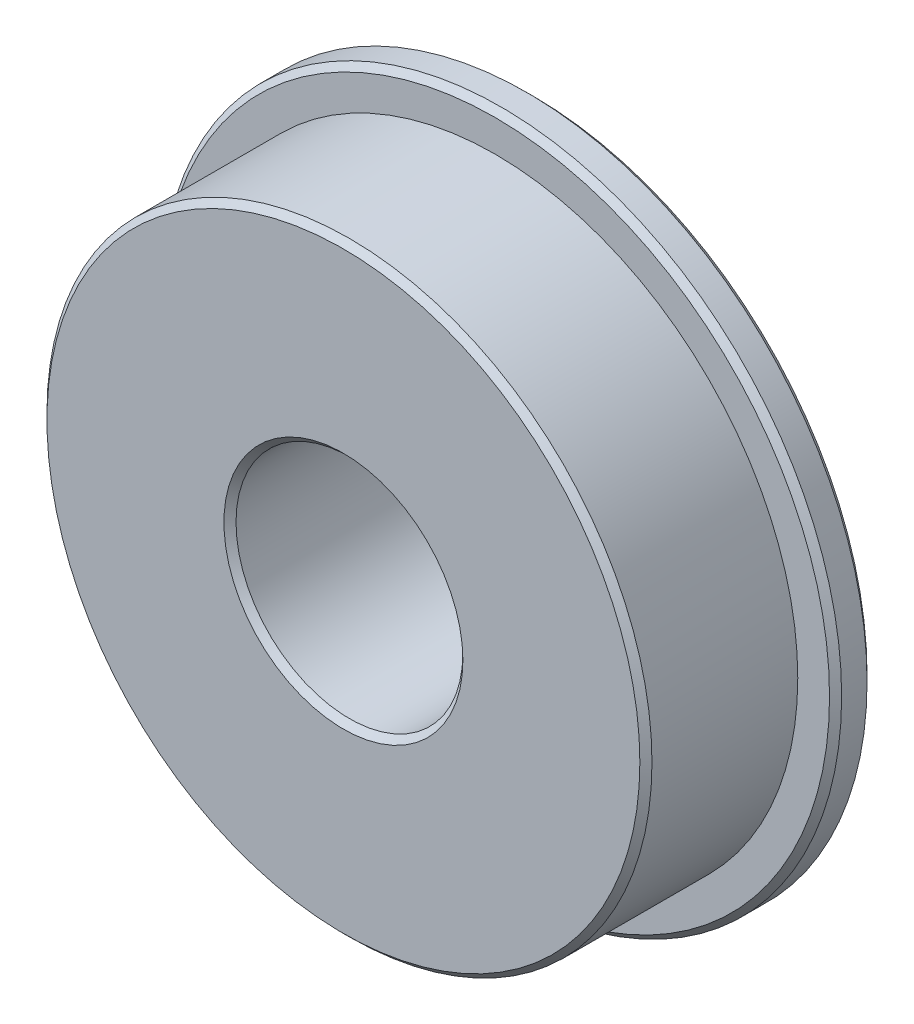
ISO-10303-21;
HEADER;
FILE_DESCRIPTION(('STEP AP214'),'2;1');
FILE_NAME('part.step','',(''),(''),'','','');
FILE_SCHEMA(('AUTOMOTIVE_DESIGN { 1 0 10303 214 1 1 1 1 }'));
ENDSEC;
DATA;
#1=APPLICATION_CONTEXT('core data for automotive mechanical design processes');
#2=APPLICATION_PROTOCOL_DEFINITION('international standard','automotive_design',2000,#1);
#3=PRODUCT_CONTEXT('',#1,'mechanical');
#4=PRODUCT('Part','Part','',(#3));
#5=PRODUCT_RELATED_PRODUCT_CATEGORY('part','',(#4));
#6=PRODUCT_DEFINITION_FORMATION('','',#4);
#7=PRODUCT_DEFINITION_CONTEXT('part definition',#1,'design');
#8=PRODUCT_DEFINITION('design','',#6,#7);
#9=PRODUCT_DEFINITION_SHAPE('','',#8);
#10=(LENGTH_UNIT() NAMED_UNIT(*) SI_UNIT(.MILLI.,.METRE.));
#11=(NAMED_UNIT(*) PLANE_ANGLE_UNIT() SI_UNIT($,.RADIAN.));
#12=(NAMED_UNIT(*) SI_UNIT($,.STERADIAN.) SOLID_ANGLE_UNIT());
#13=UNCERTAINTY_MEASURE_WITH_UNIT(LENGTH_MEASURE(1.E-05),#10,'distance_accuracy_value','');
#14=(GEOMETRIC_REPRESENTATION_CONTEXT(3) GLOBAL_UNCERTAINTY_ASSIGNED_CONTEXT((#13)) GLOBAL_UNIT_ASSIGNED_CONTEXT((#10,
#11,#12)) REPRESENTATION_CONTEXT('',''));
#15=CARTESIAN_POINT('',(0.,0.,0.));
#16=DIRECTION('',(0.,0.,1.));
#17=DIRECTION('',(1.,0.,0.));
#18=AXIS2_PLACEMENT_3D('',#15,#16,#17);
#19=CARTESIAN_POINT('',(-2.25753846153434,6.04195804195805,7.95020000007088));
#20=DIRECTION('',(0.,0.,1.));
#21=DIRECTION('',(1.,0.,0.));
#22=AXIS2_PLACEMENT_3D('',#19,#20,#21);
#23=PLANE('',#22);
#24=CARTESIAN_POINT('',(-7.27403846154836,6.04195804195805,7.95020000007088));
#25=DIRECTION('',(0.,0.,1.));
#26=DIRECTION('',(1.,0.,0.));
#27=AXIS2_PLACEMENT_3D('',#24,#25,#26);
#28=CIRCLE('',#27,12.4460000000249);
#29=CARTESIAN_POINT('',(5.17196153847652,6.04195804195805,7.95020000007088));
#30=VERTEX_POINT('',#29);
#31=EDGE_CURVE('E10',#30,#30,#28,.T.);
#32=ORIENTED_EDGE('',*,*,#31,.T.);
#33=EDGE_LOOP('',(#32));
#34=FACE_BOUND('',#33,.T.);
#35=CARTESIAN_POINT('',(-7.27403846154836,6.04195804195805,7.95020000007088));
#36=DIRECTION('',(0.,0.,1.));
#37=DIRECTION('',(1.,0.,0.));
#38=AXIS2_PLACEMENT_3D('',#35,#36,#37);
#39=CIRCLE('',#38,5.01650000001402);
#40=CARTESIAN_POINT('',(-2.25753846153434,6.04195804195805,7.95020000007088));
#41=VERTEX_POINT('',#40);
#42=EDGE_CURVE('E66',#41,#41,#39,.T.);
#43=ORIENTED_EDGE('',*,*,#42,.F.);
#44=EDGE_LOOP('',(#43));
#45=FACE_BOUND('',#44,.T.);
#46=ADVANCED_FACE('F29',(#34,#45),#23,.T.);
#47=CARTESIAN_POINT('',(-7.27403846154836,6.04195804195805,7.95020000007088));
#48=DIRECTION('',(0.,0.,-1.));
#49=DIRECTION('',(-1.,0.,0.));
#50=AXIS2_PLACEMENT_3D('',#47,#48,#49);
#51=CONICAL_SURFACE('',#50,12.4460000000249,0.785398163397448);
#52=CARTESIAN_POINT('',(-7.27403846154836,6.04195804195805,7.69620000007089));
#53=DIRECTION('',(0.,0.,1.));
#54=DIRECTION('',(1.,0.,0.));
#55=AXIS2_PLACEMENT_3D('',#52,#53,#54);
#56=CIRCLE('',#55,12.7000000000249);
#57=CARTESIAN_POINT('',(5.42596153847651,6.04195804195805,7.69620000007089));
#58=VERTEX_POINT('',#57);
#59=EDGE_CURVE('E35',#58,#58,#56,.T.);
#60=ORIENTED_EDGE('',*,*,#59,.T.);
#61=EDGE_LOOP('',(#60));
#62=FACE_BOUND('',#61,.T.);
#63=ORIENTED_EDGE('',*,*,#31,.F.);
#64=EDGE_LOOP('',(#63));
#65=FACE_BOUND('',#64,.T.);
#66=ADVANCED_FACE('F74',(#62,#65),#51,.T.);
#67=CARTESIAN_POINT('',(-7.27403846154836,6.04195804195805,-5.6843418860808E-11));
#68=DIRECTION('',(0.,0.,1.));
#69=DIRECTION('',(1.,0.,0.));
#70=AXIS2_PLACEMENT_3D('',#67,#68,#69);
#71=CYLINDRICAL_SURFACE('',#70,12.7000000000249);
#72=CARTESIAN_POINT('',(-7.27403846154836,6.04195804195805,1.57479999999999));
#73=DIRECTION('',(0.,0.,1.));
#74=DIRECTION('',(1.,0.,0.));
#75=AXIS2_PLACEMENT_3D('',#72,#73,#74);
#76=CIRCLE('',#75,12.7000000000249);
#77=CARTESIAN_POINT('',(5.42596153847651,6.04195804195805,1.57479999999999));
#78=VERTEX_POINT('',#77);
#79=EDGE_CURVE('E39',#78,#78,#76,.T.);
#80=ORIENTED_EDGE('',*,*,#79,.T.);
#81=EDGE_LOOP('',(#80));
#82=FACE_BOUND('',#81,.T.);
#83=ORIENTED_EDGE('',*,*,#59,.F.);
#84=EDGE_LOOP('',(#83));
#85=FACE_BOUND('',#84,.T.);
#86=ADVANCED_FACE('F78',(#82,#85),#71,.T.);
#87=CARTESIAN_POINT('',(5.42596153847651,6.04195804195805,1.57479999999998));
#88=DIRECTION('',(0.,0.,1.));
#89=DIRECTION('',(1.,0.,0.));
#90=AXIS2_PLACEMENT_3D('',#87,#88,#89);
#91=PLANE('',#90);
#92=CARTESIAN_POINT('',(-7.27403846154836,6.04195804195805,1.57479999999998));
#93=DIRECTION('',(0.,0.,1.));
#94=DIRECTION('',(1.,0.,0.));
#95=AXIS2_PLACEMENT_3D('',#92,#93,#94);
#96=CIRCLE('',#95,14.0335000000099);
#97=CARTESIAN_POINT('',(6.75946153846156,6.04195804195805,1.57479999999998));
#98=VERTEX_POINT('',#97);
#99=EDGE_CURVE('E43',#98,#98,#96,.T.);
#100=ORIENTED_EDGE('',*,*,#99,.T.);
#101=EDGE_LOOP('',(#100));
#102=FACE_BOUND('',#101,.T.);
#103=ORIENTED_EDGE('',*,*,#79,.F.);
#104=EDGE_LOOP('',(#103));
#105=FACE_BOUND('',#104,.T.);
#106=ADVANCED_FACE('F82',(#102,#105),#91,.T.);
#107=CARTESIAN_POINT('',(-7.27403846154836,6.04195804195805,1.57479999999998));
#108=DIRECTION('',(0.,0.,-1.));
#109=DIRECTION('',(-1.,0.,0.));
#110=AXIS2_PLACEMENT_3D('',#107,#108,#109);
#111=CONICAL_SURFACE('',#110,14.0335000000099,0.785398163397444);
#112=CARTESIAN_POINT('',(-7.27403846154836,6.04195804195805,1.3208));
#113=DIRECTION('',(0.,0.,1.));
#114=DIRECTION('',(1.,0.,0.));
#115=AXIS2_PLACEMENT_3D('',#112,#113,#114);
#116=CIRCLE('',#115,14.2875000000099);
#117=CARTESIAN_POINT('',(7.01346153846154,6.04195804195805,1.3208));
#118=VERTEX_POINT('',#117);
#119=EDGE_CURVE('E48',#118,#118,#116,.T.);
#120=ORIENTED_EDGE('',*,*,#119,.T.);
#121=EDGE_LOOP('',(#120));
#122=FACE_BOUND('',#121,.T.);
#123=ORIENTED_EDGE('',*,*,#99,.F.);
#124=EDGE_LOOP('',(#123));
#125=FACE_BOUND('',#124,.T.);
#126=ADVANCED_FACE('F89',(#122,#125),#111,.T.);
#127=CARTESIAN_POINT('',(-7.27403846154836,6.04195804195805,-5.6843418860808E-11));
#128=DIRECTION('',(0.,0.,1.));
#129=DIRECTION('',(1.,0.,0.));
#130=AXIS2_PLACEMENT_3D('',#127,#128,#129);
#131=CYLINDRICAL_SURFACE('',#130,14.2875000000099);
#132=CARTESIAN_POINT('',(-7.27403846154836,6.04195804195805,0.254000000000022));
#133=DIRECTION('',(0.,0.,1.));
#134=DIRECTION('',(1.,0.,0.));
#135=AXIS2_PLACEMENT_3D('',#132,#133,#134);
#136=CIRCLE('',#135,14.2875000000099);
#137=CARTESIAN_POINT('',(7.01346153846156,6.04195804195805,0.254000000000022));
#138=VERTEX_POINT('',#137);
#139=EDGE_CURVE('E51',#138,#138,#136,.T.);
#140=ORIENTED_EDGE('',*,*,#139,.T.);
#141=EDGE_LOOP('',(#140));
#142=FACE_BOUND('',#141,.T.);
#143=ORIENTED_EDGE('',*,*,#119,.F.);
#144=EDGE_LOOP('',(#143));
#145=FACE_BOUND('',#144,.T.);
#146=ADVANCED_FACE('F93',(#142,#145),#131,.T.);
#147=CARTESIAN_POINT('',(-7.27403846154836,6.04195804195805,0.254000000000022));
#148=DIRECTION('',(0.,0.,1.));
#149=DIRECTION('',(1.,0.,0.));
#150=AXIS2_PLACEMENT_3D('',#147,#148,#149);
#151=CONICAL_SURFACE('',#150,14.2875000000099,0.785398163397447);
#152=CARTESIAN_POINT('',(-7.27403846154836,6.04195804195805,0.));
#153=DIRECTION('',(0.,0.,1.));
#154=DIRECTION('',(1.,0.,0.));
#155=AXIS2_PLACEMENT_3D('',#152,#153,#154);
#156=CIRCLE('',#155,14.0335000000099);
#157=CARTESIAN_POINT('',(6.75946153846156,6.04195804195805,0.));
#158=VERTEX_POINT('',#157);
#159=EDGE_CURVE('E54',#158,#158,#156,.T.);
#160=ORIENTED_EDGE('',*,*,#159,.T.);
#161=EDGE_LOOP('',(#160));
#162=FACE_BOUND('',#161,.T.);
#163=ORIENTED_EDGE('',*,*,#139,.F.);
#164=EDGE_LOOP('',(#163));
#165=FACE_BOUND('',#164,.T.);
#166=ADVANCED_FACE('F97',(#162,#165),#151,.T.);
#167=CARTESIAN_POINT('',(6.75946153846156,6.04195804195805,0.));
#168=DIRECTION('',(0.,0.,-1.));
#169=DIRECTION('',(-1.,0.,0.));
#170=AXIS2_PLACEMENT_3D('',#167,#168,#169);
#171=PLANE('',#170);
#172=CARTESIAN_POINT('',(-7.27403846154836,6.04195804195805,0.));
#173=DIRECTION('',(0.,0.,1.));
#174=DIRECTION('',(1.,0.,0.));
#175=AXIS2_PLACEMENT_3D('',#172,#173,#174);
#176=CIRCLE('',#175,5.01649999998399);
#177=CARTESIAN_POINT('',(-2.25753846156437,6.04195804195805,0.));
#178=VERTEX_POINT('',#177);
#179=EDGE_CURVE('E57',#178,#178,#176,.T.);
#180=ORIENTED_EDGE('',*,*,#179,.T.);
#181=EDGE_LOOP('',(#180));
#182=FACE_BOUND('',#181,.T.);
#183=ORIENTED_EDGE('',*,*,#159,.F.);
#184=EDGE_LOOP('',(#183));
#185=FACE_BOUND('',#184,.T.);
#186=ADVANCED_FACE('F101',(#182,#185),#171,.T.);
#187=CARTESIAN_POINT('',(-7.27403846154836,6.04195804195805,0.));
#188=DIRECTION('',(0.,0.,-1.));
#189=DIRECTION('',(-1.,0.,0.));
#190=AXIS2_PLACEMENT_3D('',#187,#188,#189);
#191=CONICAL_SURFACE('',#190,5.01649999998399,0.785398163397448);
#192=CARTESIAN_POINT('',(-7.27403846154836,6.04195804195805,0.253999999984007));
#193=DIRECTION('',(0.,0.,1.));
#194=DIRECTION('',(1.,0.,0.));
#195=AXIS2_PLACEMENT_3D('',#192,#193,#194);
#196=CIRCLE('',#195,4.7625);
#197=CARTESIAN_POINT('',(-2.51153846154836,6.04195804195805,0.253999999984007));
#198=VERTEX_POINT('',#197);
#199=EDGE_CURVE('E60',#198,#198,#196,.T.);
#200=ORIENTED_EDGE('',*,*,#199,.T.);
#201=EDGE_LOOP('',(#200));
#202=FACE_BOUND('',#201,.T.);
#203=ORIENTED_EDGE('',*,*,#179,.F.);
#204=EDGE_LOOP('',(#203));
#205=FACE_BOUND('',#204,.T.);
#206=ADVANCED_FACE('F105',(#202,#205),#191,.F.);
#207=CARTESIAN_POINT('',(-7.27403846154836,6.04195804195805,-5.6843418860808E-11));
#208=DIRECTION('',(0.,0.,1.));
#209=DIRECTION('',(1.,0.,0.));
#210=AXIS2_PLACEMENT_3D('',#207,#208,#209);
#211=CYLINDRICAL_SURFACE('',#210,4.7625);
#212=CARTESIAN_POINT('',(-7.27403846154836,6.04195804195805,7.69620000005686));
#213=DIRECTION('',(0.,0.,1.));
#214=DIRECTION('',(1.,0.,0.));
#215=AXIS2_PLACEMENT_3D('',#212,#213,#214);
#216=CIRCLE('',#215,4.7625);
#217=CARTESIAN_POINT('',(-2.51153846154836,6.04195804195805,7.69620000005686));
#218=VERTEX_POINT('',#217);
#219=EDGE_CURVE('E63',#218,#218,#216,.T.);
#220=ORIENTED_EDGE('',*,*,#219,.T.);
#221=EDGE_LOOP('',(#220));
#222=FACE_BOUND('',#221,.T.);
#223=ORIENTED_EDGE('',*,*,#199,.F.);
#224=EDGE_LOOP('',(#223));
#225=FACE_BOUND('',#224,.T.);
#226=ADVANCED_FACE('F109',(#222,#225),#211,.F.);
#227=CARTESIAN_POINT('',(-7.27403846154836,6.04195804195805,7.69620000005686));
#228=DIRECTION('',(0.,0.,1.));
#229=DIRECTION('',(1.,0.,0.));
#230=AXIS2_PLACEMENT_3D('',#227,#228,#229);
#231=CONICAL_SURFACE('',#230,4.7625,0.785398163397445);
#232=ORIENTED_EDGE('',*,*,#42,.T.);
#233=EDGE_LOOP('',(#232));
#234=FACE_BOUND('',#233,.T.);
#235=ORIENTED_EDGE('',*,*,#219,.F.);
#236=EDGE_LOOP('',(#235));
#237=FACE_BOUND('',#236,.T.);
#238=ADVANCED_FACE('F70',(#234,#237),#231,.F.);
#239=CLOSED_SHELL('',(#46,#66,#86,#106,#126,#146,#166,#186,#206,#226,#238));
#240=MANIFOLD_SOLID_BREP('B2',#239);
#241=ADVANCED_BREP_SHAPE_REPRESENTATION('',(#18,#240),#14);
#242=SHAPE_DEFINITION_REPRESENTATION(#9,#241);
ENDSEC;
END-ISO-10303-21;
